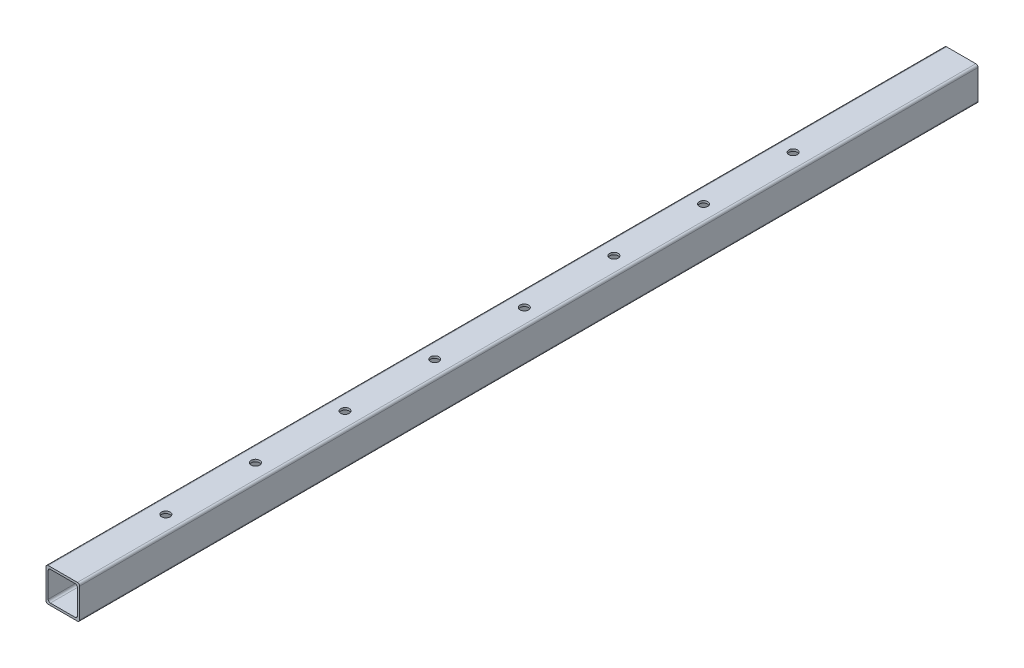
ISO-10303-21;
HEADER;
FILE_DESCRIPTION(('STEP AP214'),'2;1');
FILE_NAME('part.step','',(''),(''),'','','');
FILE_SCHEMA(('AUTOMOTIVE_DESIGN { 1 0 10303 214 1 1 1 1 }'));
ENDSEC;
DATA;
#1=APPLICATION_CONTEXT('core data for automotive mechanical design processes');
#2=APPLICATION_PROTOCOL_DEFINITION('international standard','automotive_design',2000,#1);
#3=PRODUCT_CONTEXT('',#1,'mechanical');
#4=PRODUCT('Part','Part','',(#3));
#5=PRODUCT_RELATED_PRODUCT_CATEGORY('part','',(#4));
#6=PRODUCT_DEFINITION_FORMATION('','',#4);
#7=PRODUCT_DEFINITION_CONTEXT('part definition',#1,'design');
#8=PRODUCT_DEFINITION('design','',#6,#7);
#9=PRODUCT_DEFINITION_SHAPE('','',#8);
#10=(LENGTH_UNIT() NAMED_UNIT(*) SI_UNIT(.MILLI.,.METRE.));
#11=(NAMED_UNIT(*) PLANE_ANGLE_UNIT() SI_UNIT($,.RADIAN.));
#12=(NAMED_UNIT(*) SI_UNIT($,.STERADIAN.) SOLID_ANGLE_UNIT());
#13=UNCERTAINTY_MEASURE_WITH_UNIT(LENGTH_MEASURE(1.E-05),#10,'distance_accuracy_value','');
#14=(GEOMETRIC_REPRESENTATION_CONTEXT(3) GLOBAL_UNCERTAINTY_ASSIGNED_CONTEXT((#13)) GLOBAL_UNIT_ASSIGNED_CONTEXT((#10,
#11,#12)) REPRESENTATION_CONTEXT('',''));
#15=CARTESIAN_POINT('',(0.,0.,0.));
#16=DIRECTION('',(0.,0.,1.));
#17=DIRECTION('',(1.,0.,0.));
#18=AXIS2_PLACEMENT_3D('',#15,#16,#17);
#19=CARTESIAN_POINT('',(0.,0.,254.635));
#20=DIRECTION('',(0.,0.,1.));
#21=DIRECTION('',(1.,0.,0.));
#22=AXIS2_PLACEMENT_3D('',#19,#20,#21);
#23=PLANE('',#22);
#24=DIRECTION('',(-1.,0.,0.));
#25=VECTOR('',#24,1.);
#26=CARTESIAN_POINT('',(9.525,9.525,254.635));
#27=LINE('',#26,#25);
#28=CARTESIAN_POINT('',(8.2804,9.525,254.635));
#29=VERTEX_POINT('',#28);
#30=CARTESIAN_POINT('',(-8.28039999999999,9.525,254.635));
#31=VERTEX_POINT('',#30);
#32=EDGE_CURVE('E340',#29,#31,#27,.T.);
#33=ORIENTED_EDGE('',*,*,#32,.T.);
#34=CARTESIAN_POINT('',(-8.2804,8.2804,254.635));
#35=DIRECTION('',(0.,0.,1.));
#36=DIRECTION('',(1.,0.,0.));
#37=AXIS2_PLACEMENT_3D('',#34,#35,#36);
#38=CIRCLE('',#37,1.2446);
#39=CARTESIAN_POINT('',(-9.525,8.2804,254.635));
#40=VERTEX_POINT('',#39);
#41=EDGE_CURVE('E230',#31,#40,#38,.T.);
#42=ORIENTED_EDGE('',*,*,#41,.T.);
#43=DIRECTION('',(0.,-1.,0.));
#44=VECTOR('',#43,1.);
#45=CARTESIAN_POINT('',(-9.525,9.525,254.635));
#46=LINE('',#45,#44);
#47=CARTESIAN_POINT('',(-9.525,-8.2804,254.635));
#48=VERTEX_POINT('',#47);
#49=EDGE_CURVE('E185',#40,#48,#46,.T.);
#50=ORIENTED_EDGE('',*,*,#49,.T.);
#51=CARTESIAN_POINT('',(-8.2804,-8.2804,254.635));
#52=DIRECTION('',(0.,0.,1.));
#53=DIRECTION('',(1.,0.,0.));
#54=AXIS2_PLACEMENT_3D('',#51,#52,#53);
#55=CIRCLE('',#54,1.2446);
#56=CARTESIAN_POINT('',(-8.2804,-9.525,254.635));
#57=VERTEX_POINT('',#56);
#58=EDGE_CURVE('E224',#48,#57,#55,.T.);
#59=ORIENTED_EDGE('',*,*,#58,.T.);
#60=DIRECTION('',(1.,0.,0.));
#61=VECTOR('',#60,1.);
#62=CARTESIAN_POINT('',(-9.525,-9.525,254.635));
#63=LINE('',#62,#61);
#64=CARTESIAN_POINT('',(8.28039999999999,-9.525,254.635));
#65=VERTEX_POINT('',#64);
#66=EDGE_CURVE('E208',#57,#65,#63,.T.);
#67=ORIENTED_EDGE('',*,*,#66,.T.);
#68=CARTESIAN_POINT('',(8.2804,-8.2804,254.635));
#69=DIRECTION('',(0.,0.,1.));
#70=DIRECTION('',(1.,0.,0.));
#71=AXIS2_PLACEMENT_3D('',#68,#69,#70);
#72=CIRCLE('',#71,1.2446);
#73=CARTESIAN_POINT('',(9.525,-8.2804,254.635));
#74=VERTEX_POINT('',#73);
#75=EDGE_CURVE('E227',#65,#74,#72,.T.);
#76=ORIENTED_EDGE('',*,*,#75,.T.);
#77=DIRECTION('',(0.,1.,0.));
#78=VECTOR('',#77,1.);
#79=CARTESIAN_POINT('',(9.525,-9.525,254.635));
#80=LINE('',#79,#78);
#81=CARTESIAN_POINT('',(9.525,8.2804,254.635));
#82=VERTEX_POINT('',#81);
#83=EDGE_CURVE('E201',#74,#82,#80,.T.);
#84=ORIENTED_EDGE('',*,*,#83,.T.);
#85=CARTESIAN_POINT('',(8.2804,8.2804,254.635));
#86=DIRECTION('',(0.,0.,1.));
#87=DIRECTION('',(1.,0.,0.));
#88=AXIS2_PLACEMENT_3D('',#85,#86,#87);
#89=CIRCLE('',#88,1.2446);
#90=EDGE_CURVE('E221',#82,#29,#89,.T.);
#91=ORIENTED_EDGE('',*,*,#90,.T.);
#92=EDGE_LOOP('',(#33,#42,#50,#59,#67,#76,#84,#91));
#93=FACE_BOUND('',#92,.T.);
#94=DIRECTION('',(0.,1.,0.));
#95=VECTOR('',#94,1.);
#96=CARTESIAN_POINT('',(8.2804,8.2804,254.635));
#97=LINE('',#96,#95);
#98=CARTESIAN_POINT('',(8.2804,-7.0358,254.635));
#99=VERTEX_POINT('',#98);
#100=CARTESIAN_POINT('',(8.2804,7.0358,254.635));
#101=VERTEX_POINT('',#100);
#102=EDGE_CURVE('E308',#99,#101,#97,.T.);
#103=ORIENTED_EDGE('',*,*,#102,.F.);
#104=CARTESIAN_POINT('',(7.0358,-7.0358,254.635));
#105=DIRECTION('',(0.,0.,1.));
#106=DIRECTION('',(1.,0.,0.));
#107=AXIS2_PLACEMENT_3D('',#104,#105,#106);
#108=CIRCLE('',#107,1.2446);
#109=CARTESIAN_POINT('',(7.0358,-8.2804,254.635));
#110=VERTEX_POINT('',#109);
#111=EDGE_CURVE('E277',#99,#110,#108,.F.);
#112=ORIENTED_EDGE('',*,*,#111,.T.);
#113=DIRECTION('',(1.,0.,0.));
#114=VECTOR('',#113,1.);
#115=CARTESIAN_POINT('',(8.2804,-8.2804,254.635));
#116=LINE('',#115,#114);
#117=CARTESIAN_POINT('',(-7.0358,-8.2804,254.635));
#118=VERTEX_POINT('',#117);
#119=EDGE_CURVE('E315',#118,#110,#116,.T.);
#120=ORIENTED_EDGE('',*,*,#119,.F.);
#121=CARTESIAN_POINT('',(-7.0358,-7.0358,254.635));
#122=DIRECTION('',(0.,0.,1.));
#123=DIRECTION('',(1.,0.,0.));
#124=AXIS2_PLACEMENT_3D('',#121,#122,#123);
#125=CIRCLE('',#124,1.2446);
#126=CARTESIAN_POINT('',(-8.2804,-7.0358,254.635));
#127=VERTEX_POINT('',#126);
#128=EDGE_CURVE('E283',#118,#127,#125,.F.);
#129=ORIENTED_EDGE('',*,*,#128,.T.);
#130=DIRECTION('',(0.,-1.,0.));
#131=VECTOR('',#130,1.);
#132=CARTESIAN_POINT('',(-8.2804,-8.2804,254.635));
#133=LINE('',#132,#131);
#134=CARTESIAN_POINT('',(-8.2804,7.0358,254.635));
#135=VERTEX_POINT('',#134);
#136=EDGE_CURVE('E319',#135,#127,#133,.T.);
#137=ORIENTED_EDGE('',*,*,#136,.F.);
#138=CARTESIAN_POINT('',(-7.0358,7.0358,254.635));
#139=DIRECTION('',(0.,0.,1.));
#140=DIRECTION('',(1.,0.,0.));
#141=AXIS2_PLACEMENT_3D('',#138,#139,#140);
#142=CIRCLE('',#141,1.2446);
#143=CARTESIAN_POINT('',(-7.0358,8.2804,254.635));
#144=VERTEX_POINT('',#143);
#145=EDGE_CURVE('E65',#135,#144,#142,.F.);
#146=ORIENTED_EDGE('',*,*,#145,.T.);
#147=DIRECTION('',(-1.,0.,0.));
#148=VECTOR('',#147,1.);
#149=CARTESIAN_POINT('',(-8.2804,8.2804,254.635));
#150=LINE('',#149,#148);
#151=CARTESIAN_POINT('',(7.0358,8.2804,254.635));
#152=VERTEX_POINT('',#151);
#153=EDGE_CURVE('E310',#152,#144,#150,.T.);
#154=ORIENTED_EDGE('',*,*,#153,.F.);
#155=CARTESIAN_POINT('',(7.0358,7.0358,254.635));
#156=DIRECTION('',(0.,0.,1.));
#157=DIRECTION('',(1.,0.,0.));
#158=AXIS2_PLACEMENT_3D('',#155,#156,#157);
#159=CIRCLE('',#158,1.2446);
#160=EDGE_CURVE('E11',#152,#101,#159,.F.);
#161=ORIENTED_EDGE('',*,*,#160,.T.);
#162=EDGE_LOOP('',(#103,#112,#120,#129,#137,#146,#154,#161));
#163=FACE_BOUND('',#162,.T.);
#164=ADVANCED_FACE('F49',(#93,#163),#23,.T.);
#165=CARTESIAN_POINT('',(0.,0.,-254.635));
#166=DIRECTION('',(0.,0.,1.));
#167=DIRECTION('',(1.,0.,0.));
#168=AXIS2_PLACEMENT_3D('',#165,#166,#167);
#169=PLANE('',#168);
#170=DIRECTION('',(0.,-1.,0.));
#171=VECTOR('',#170,1.);
#172=CARTESIAN_POINT('',(-9.525,9.525,-254.635));
#173=LINE('',#172,#171);
#174=CARTESIAN_POINT('',(-9.525,8.2804,-254.635));
#175=VERTEX_POINT('',#174);
#176=CARTESIAN_POINT('',(-9.525,-8.2804,-254.635));
#177=VERTEX_POINT('',#176);
#178=EDGE_CURVE('E182',#175,#177,#173,.T.);
#179=ORIENTED_EDGE('',*,*,#178,.F.);
#180=CARTESIAN_POINT('',(-8.2804,8.2804,-254.635));
#181=DIRECTION('',(0.,0.,1.));
#182=DIRECTION('',(1.,0.,0.));
#183=AXIS2_PLACEMENT_3D('',#180,#181,#182);
#184=CIRCLE('',#183,1.2446);
#185=CARTESIAN_POINT('',(-8.28039999999999,9.525,-254.635));
#186=VERTEX_POINT('',#185);
#187=EDGE_CURVE('E164',#175,#186,#184,.F.);
#188=ORIENTED_EDGE('',*,*,#187,.T.);
#189=DIRECTION('',(-1.,0.,0.));
#190=VECTOR('',#189,1.);
#191=CARTESIAN_POINT('',(9.525,9.525,-254.635));
#192=LINE('',#191,#190);
#193=CARTESIAN_POINT('',(8.2804,9.525,-254.635));
#194=VERTEX_POINT('',#193);
#195=EDGE_CURVE('E196',#194,#186,#192,.T.);
#196=ORIENTED_EDGE('',*,*,#195,.F.);
#197=CARTESIAN_POINT('',(8.2804,8.2804,-254.635));
#198=DIRECTION('',(0.,0.,1.));
#199=DIRECTION('',(1.,0.,0.));
#200=AXIS2_PLACEMENT_3D('',#197,#198,#199);
#201=CIRCLE('',#200,1.2446);
#202=CARTESIAN_POINT('',(9.525,8.2804,-254.635));
#203=VERTEX_POINT('',#202);
#204=EDGE_CURVE('E187',#194,#203,#201,.F.);
#205=ORIENTED_EDGE('',*,*,#204,.T.);
#206=DIRECTION('',(0.,1.,0.));
#207=VECTOR('',#206,1.);
#208=CARTESIAN_POINT('',(9.525,-9.525,-254.635));
#209=LINE('',#208,#207);
#210=CARTESIAN_POINT('',(9.525,-8.2804,-254.635));
#211=VERTEX_POINT('',#210);
#212=EDGE_CURVE('E203',#211,#203,#209,.T.);
#213=ORIENTED_EDGE('',*,*,#212,.F.);
#214=CARTESIAN_POINT('',(8.2804,-8.2804,-254.635));
#215=DIRECTION('',(0.,0.,1.));
#216=DIRECTION('',(1.,0.,0.));
#217=AXIS2_PLACEMENT_3D('',#214,#215,#216);
#218=CIRCLE('',#217,1.2446);
#219=CARTESIAN_POINT('',(8.28039999999999,-9.525,-254.635));
#220=VERTEX_POINT('',#219);
#221=EDGE_CURVE('E176',#211,#220,#218,.F.);
#222=ORIENTED_EDGE('',*,*,#221,.T.);
#223=DIRECTION('',(1.,0.,0.));
#224=VECTOR('',#223,1.);
#225=CARTESIAN_POINT('',(-9.525,-9.525,-254.635));
#226=LINE('',#225,#224);
#227=CARTESIAN_POINT('',(-8.2804,-9.525,-254.635));
#228=VERTEX_POINT('',#227);
#229=EDGE_CURVE('E195',#228,#220,#226,.T.);
#230=ORIENTED_EDGE('',*,*,#229,.F.);
#231=CARTESIAN_POINT('',(-8.2804,-8.2804,-254.635));
#232=DIRECTION('',(0.,0.,1.));
#233=DIRECTION('',(1.,0.,0.));
#234=AXIS2_PLACEMENT_3D('',#231,#232,#233);
#235=CIRCLE('',#234,1.2446);
#236=EDGE_CURVE('E193',#228,#177,#235,.F.);
#237=ORIENTED_EDGE('',*,*,#236,.T.);
#238=EDGE_LOOP('',(#179,#188,#196,#205,#213,#222,#230,#237));
#239=FACE_BOUND('',#238,.T.);
#240=DIRECTION('',(0.,-1.,0.));
#241=VECTOR('',#240,1.);
#242=CARTESIAN_POINT('',(-8.2804,-8.2804,-254.635));
#243=LINE('',#242,#241);
#244=CARTESIAN_POINT('',(-8.2804,7.0358,-254.635));
#245=VERTEX_POINT('',#244);
#246=CARTESIAN_POINT('',(-8.2804,-7.0358,-254.635));
#247=VERTEX_POINT('',#246);
#248=EDGE_CURVE('E302',#245,#247,#243,.T.);
#249=ORIENTED_EDGE('',*,*,#248,.T.);
#250=CARTESIAN_POINT('',(-7.0358,-7.0358,-254.635));
#251=DIRECTION('',(0.,0.,1.));
#252=DIRECTION('',(1.,0.,0.));
#253=AXIS2_PLACEMENT_3D('',#250,#251,#252);
#254=CIRCLE('',#253,1.2446);
#255=CARTESIAN_POINT('',(-7.0358,-8.2804,-254.635));
#256=VERTEX_POINT('',#255);
#257=EDGE_CURVE('E280',#247,#256,#254,.T.);
#258=ORIENTED_EDGE('',*,*,#257,.T.);
#259=DIRECTION('',(1.,0.,0.));
#260=VECTOR('',#259,1.);
#261=CARTESIAN_POINT('',(8.2804,-8.2804,-254.635));
#262=LINE('',#261,#260);
#263=CARTESIAN_POINT('',(7.0358,-8.2804,-254.635));
#264=VERTEX_POINT('',#263);
#265=EDGE_CURVE('E328',#256,#264,#262,.T.);
#266=ORIENTED_EDGE('',*,*,#265,.T.);
#267=CARTESIAN_POINT('',(7.0358,-7.0358,-254.635));
#268=DIRECTION('',(0.,0.,1.));
#269=DIRECTION('',(1.,0.,0.));
#270=AXIS2_PLACEMENT_3D('',#267,#268,#269);
#271=CIRCLE('',#270,1.2446);
#272=CARTESIAN_POINT('',(8.2804,-7.0358,-254.635));
#273=VERTEX_POINT('',#272);
#274=EDGE_CURVE('E274',#264,#273,#271,.T.);
#275=ORIENTED_EDGE('',*,*,#274,.T.);
#276=DIRECTION('',(0.,1.,0.));
#277=VECTOR('',#276,1.);
#278=CARTESIAN_POINT('',(8.2804,8.2804,-254.635));
#279=LINE('',#278,#277);
#280=CARTESIAN_POINT('',(8.2804,7.0358,-254.635));
#281=VERTEX_POINT('',#280);
#282=EDGE_CURVE('E296',#273,#281,#279,.T.);
#283=ORIENTED_EDGE('',*,*,#282,.T.);
#284=CARTESIAN_POINT('',(7.0358,7.0358,-254.635));
#285=DIRECTION('',(0.,0.,1.));
#286=DIRECTION('',(1.,0.,0.));
#287=AXIS2_PLACEMENT_3D('',#284,#285,#286);
#288=CIRCLE('',#287,1.2446);
#289=CARTESIAN_POINT('',(7.0358,8.2804,-254.635));
#290=VERTEX_POINT('',#289);
#291=EDGE_CURVE('E58',#281,#290,#288,.T.);
#292=ORIENTED_EDGE('',*,*,#291,.T.);
#293=DIRECTION('',(-1.,0.,0.));
#294=VECTOR('',#293,1.);
#295=CARTESIAN_POINT('',(-8.2804,8.2804,-254.635));
#296=LINE('',#295,#294);
#297=CARTESIAN_POINT('',(-7.0358,8.2804,-254.635));
#298=VERTEX_POINT('',#297);
#299=EDGE_CURVE('E294',#290,#298,#296,.T.);
#300=ORIENTED_EDGE('',*,*,#299,.T.);
#301=CARTESIAN_POINT('',(-7.0358,7.0358,-254.635));
#302=DIRECTION('',(0.,0.,1.));
#303=DIRECTION('',(1.,0.,0.));
#304=AXIS2_PLACEMENT_3D('',#301,#302,#303);
#305=CIRCLE('',#304,1.2446);
#306=EDGE_CURVE('E286',#298,#245,#305,.T.);
#307=ORIENTED_EDGE('',*,*,#306,.T.);
#308=EDGE_LOOP('',(#249,#258,#266,#275,#283,#292,#300,#307));
#309=FACE_BOUND('',#308,.T.);
#310=ADVANCED_FACE('F190',(#239,#309),#169,.F.);
#311=CARTESIAN_POINT('',(9.525,-9.525,254.635));
#312=DIRECTION('',(-1.,0.,0.));
#313=DIRECTION('',(0.,0.,1.));
#314=AXIS2_PLACEMENT_3D('',#311,#312,#313);
#315=PLANE('',#314);
#316=ORIENTED_EDGE('',*,*,#83,.F.);
#317=DIRECTION('',(0.,0.,-1.));
#318=VECTOR('',#317,1.);
#319=CARTESIAN_POINT('',(9.525,-8.2804,254.635));
#320=LINE('',#319,#318);
#321=EDGE_CURVE('E263',#74,#211,#320,.T.);
#322=ORIENTED_EDGE('',*,*,#321,.T.);
#323=ORIENTED_EDGE('',*,*,#212,.T.);
#324=DIRECTION('',(0.,0.,-1.));
#325=VECTOR('',#324,1.);
#326=CARTESIAN_POINT('',(9.525,8.2804,254.635));
#327=LINE('',#326,#325);
#328=EDGE_CURVE('E260',#203,#82,#327,.F.);
#329=ORIENTED_EDGE('',*,*,#328,.T.);
#330=EDGE_LOOP('',(#316,#322,#323,#329));
#331=FACE_BOUND('',#330,.T.);
#332=ADVANCED_FACE('F354',(#331),#315,.F.);
#333=CARTESIAN_POINT('',(9.525,9.525,254.635));
#334=DIRECTION('',(0.,-1.,0.));
#335=DIRECTION('',(0.,0.,-1.));
#336=AXIS2_PLACEMENT_3D('',#333,#334,#335);
#337=PLANE('',#336);
#338=CARTESIAN_POINT('',(0.,9.525,-159.385));
#339=DIRECTION('',(0.,1.,0.));
#340=DIRECTION('',(0.,0.,1.));
#341=AXIS2_PLACEMENT_3D('',#338,#339,#340);
#342=CIRCLE('',#341,2.413);
#343=CARTESIAN_POINT('',(0.,9.525,-156.972));
#344=VERTEX_POINT('',#343);
#345=EDGE_CURVE('E332',#344,#344,#342,.T.);
#346=ORIENTED_EDGE('',*,*,#345,.F.);
#347=EDGE_LOOP('',(#346));
#348=FACE_BOUND('',#347,.T.);
#349=CARTESIAN_POINT('',(0.,9.525,-108.585));
#350=DIRECTION('',(0.,1.,0.));
#351=DIRECTION('',(0.,0.,1.));
#352=AXIS2_PLACEMENT_3D('',#349,#350,#351);
#353=CIRCLE('',#352,2.413);
#354=CARTESIAN_POINT('',(0.,9.525,-106.172));
#355=VERTEX_POINT('',#354);
#356=EDGE_CURVE('E664',#355,#355,#353,.T.);
#357=ORIENTED_EDGE('',*,*,#356,.F.);
#358=EDGE_LOOP('',(#357));
#359=FACE_BOUND('',#358,.T.);
#360=CARTESIAN_POINT('',(0.,9.525,-57.785));
#361=DIRECTION('',(0.,1.,0.));
#362=DIRECTION('',(0.,0.,1.));
#363=AXIS2_PLACEMENT_3D('',#360,#361,#362);
#364=CIRCLE('',#363,2.413);
#365=CARTESIAN_POINT('',(0.,9.525,-55.372));
#366=VERTEX_POINT('',#365);
#367=EDGE_CURVE('E672',#366,#366,#364,.T.);
#368=ORIENTED_EDGE('',*,*,#367,.F.);
#369=EDGE_LOOP('',(#368));
#370=FACE_BOUND('',#369,.T.);
#371=CARTESIAN_POINT('',(0.,9.525,-6.985));
#372=DIRECTION('',(0.,1.,0.));
#373=DIRECTION('',(0.,0.,1.));
#374=AXIS2_PLACEMENT_3D('',#371,#372,#373);
#375=CIRCLE('',#374,2.413);
#376=CARTESIAN_POINT('',(0.,9.525,-4.57200000000001));
#377=VERTEX_POINT('',#376);
#378=EDGE_CURVE('E680',#377,#377,#375,.T.);
#379=ORIENTED_EDGE('',*,*,#378,.F.);
#380=EDGE_LOOP('',(#379));
#381=FACE_BOUND('',#380,.T.);
#382=CARTESIAN_POINT('',(0.,9.525,43.815));
#383=DIRECTION('',(0.,1.,0.));
#384=DIRECTION('',(0.,0.,1.));
#385=AXIS2_PLACEMENT_3D('',#382,#383,#384);
#386=CIRCLE('',#385,2.413);
#387=CARTESIAN_POINT('',(0.,9.525,46.228));
#388=VERTEX_POINT('',#387);
#389=EDGE_CURVE('E688',#388,#388,#386,.T.);
#390=ORIENTED_EDGE('',*,*,#389,.F.);
#391=EDGE_LOOP('',(#390));
#392=FACE_BOUND('',#391,.T.);
#393=CARTESIAN_POINT('',(0.,9.525,94.615));
#394=DIRECTION('',(0.,1.,0.));
#395=DIRECTION('',(0.,0.,1.));
#396=AXIS2_PLACEMENT_3D('',#393,#394,#395);
#397=CIRCLE('',#396,2.413);
#398=CARTESIAN_POINT('',(0.,9.525,97.028));
#399=VERTEX_POINT('',#398);
#400=EDGE_CURVE('E696',#399,#399,#397,.T.);
#401=ORIENTED_EDGE('',*,*,#400,.F.);
#402=EDGE_LOOP('',(#401));
#403=FACE_BOUND('',#402,.T.);
#404=CARTESIAN_POINT('',(0.,9.525,145.415));
#405=DIRECTION('',(0.,1.,0.));
#406=DIRECTION('',(0.,0.,1.));
#407=AXIS2_PLACEMENT_3D('',#404,#405,#406);
#408=CIRCLE('',#407,2.413);
#409=CARTESIAN_POINT('',(0.,9.525,147.828));
#410=VERTEX_POINT('',#409);
#411=EDGE_CURVE('E704',#410,#410,#408,.T.);
#412=ORIENTED_EDGE('',*,*,#411,.F.);
#413=EDGE_LOOP('',(#412));
#414=FACE_BOUND('',#413,.T.);
#415=CARTESIAN_POINT('',(0.,9.525,196.215));
#416=DIRECTION('',(0.,1.,0.));
#417=DIRECTION('',(0.,0.,1.));
#418=AXIS2_PLACEMENT_3D('',#415,#416,#417);
#419=CIRCLE('',#418,2.413);
#420=CARTESIAN_POINT('',(0.,9.525,198.628));
#421=VERTEX_POINT('',#420);
#422=EDGE_CURVE('E711',#421,#421,#419,.T.);
#423=ORIENTED_EDGE('',*,*,#422,.F.);
#424=EDGE_LOOP('',(#423));
#425=FACE_BOUND('',#424,.T.);
#426=ORIENTED_EDGE('',*,*,#195,.T.);
#427=DIRECTION('',(0.,0.,-1.));
#428=VECTOR('',#427,1.);
#429=CARTESIAN_POINT('',(-8.2804,9.525,254.635));
#430=LINE('',#429,#428);
#431=EDGE_CURVE('E169',#186,#31,#430,.F.);
#432=ORIENTED_EDGE('',*,*,#431,.T.);
#433=ORIENTED_EDGE('',*,*,#32,.F.);
#434=DIRECTION('',(0.,0.,-1.));
#435=VECTOR('',#434,1.);
#436=CARTESIAN_POINT('',(8.2804,9.525,254.635));
#437=LINE('',#436,#435);
#438=EDGE_CURVE('E175',#29,#194,#437,.T.);
#439=ORIENTED_EDGE('',*,*,#438,.T.);
#440=EDGE_LOOP('',(#426,#432,#433,#439));
#441=FACE_BOUND('',#440,.T.);
#442=ADVANCED_FACE('F362',(#348,#359,#370,#381,#392,#403,#414,#425,#441),#337,.F.);
#443=CARTESIAN_POINT('',(-9.525,9.525,254.635));
#444=DIRECTION('',(1.,0.,0.));
#445=DIRECTION('',(0.,0.,-1.));
#446=AXIS2_PLACEMENT_3D('',#443,#444,#445);
#447=PLANE('',#446);
#448=ORIENTED_EDGE('',*,*,#49,.F.);
#449=DIRECTION('',(0.,0.,-1.));
#450=VECTOR('',#449,1.);
#451=CARTESIAN_POINT('',(-9.525,8.2804,254.635));
#452=LINE('',#451,#450);
#453=EDGE_CURVE('E168',#40,#175,#452,.T.);
#454=ORIENTED_EDGE('',*,*,#453,.T.);
#455=ORIENTED_EDGE('',*,*,#178,.T.);
#456=DIRECTION('',(0.,0.,-1.));
#457=VECTOR('',#456,1.);
#458=CARTESIAN_POINT('',(-9.525,-8.2804,254.635));
#459=LINE('',#458,#457);
#460=EDGE_CURVE('E188',#177,#48,#459,.F.);
#461=ORIENTED_EDGE('',*,*,#460,.T.);
#462=EDGE_LOOP('',(#448,#454,#455,#461));
#463=FACE_BOUND('',#462,.T.);
#464=ADVANCED_FACE('F181',(#463),#447,.F.);
#465=CARTESIAN_POINT('',(-9.525,-9.525,254.635));
#466=DIRECTION('',(0.,1.,0.));
#467=DIRECTION('',(0.,0.,1.));
#468=AXIS2_PLACEMENT_3D('',#465,#466,#467);
#469=PLANE('',#468);
#470=ORIENTED_EDGE('',*,*,#229,.T.);
#471=DIRECTION('',(0.,0.,-1.));
#472=VECTOR('',#471,1.);
#473=CARTESIAN_POINT('',(8.2804,-9.525,254.635));
#474=LINE('',#473,#472);
#475=EDGE_CURVE('E271',#220,#65,#474,.F.);
#476=ORIENTED_EDGE('',*,*,#475,.T.);
#477=ORIENTED_EDGE('',*,*,#66,.F.);
#478=DIRECTION('',(0.,0.,-1.));
#479=VECTOR('',#478,1.);
#480=CARTESIAN_POINT('',(-8.2804,-9.525,254.635));
#481=LINE('',#480,#479);
#482=EDGE_CURVE('E267',#57,#228,#481,.T.);
#483=ORIENTED_EDGE('',*,*,#482,.T.);
#484=EDGE_LOOP('',(#470,#476,#477,#483));
#485=FACE_BOUND('',#484,.T.);
#486=ADVANCED_FACE('F371',(#485),#469,.F.);
#487=CARTESIAN_POINT('',(8.2804,-8.2804,254.635));
#488=DIRECTION('',(0.,1.,0.));
#489=DIRECTION('',(0.,0.,1.));
#490=AXIS2_PLACEMENT_3D('',#487,#488,#489);
#491=PLANE('',#490);
#492=ORIENTED_EDGE('',*,*,#119,.T.);
#493=DIRECTION('',(0.,0.,-1.));
#494=VECTOR('',#493,1.);
#495=CARTESIAN_POINT('',(7.0358,-8.2804,-254.635));
#496=LINE('',#495,#494);
#497=EDGE_CURVE('E236',#110,#264,#496,.T.);
#498=ORIENTED_EDGE('',*,*,#497,.T.);
#499=ORIENTED_EDGE('',*,*,#265,.F.);
#500=DIRECTION('',(0.,0.,-1.));
#501=VECTOR('',#500,1.);
#502=CARTESIAN_POINT('',(-7.0358,-8.2804,254.635));
#503=LINE('',#502,#501);
#504=EDGE_CURVE('E233',#256,#118,#503,.F.);
#505=ORIENTED_EDGE('',*,*,#504,.T.);
#506=EDGE_LOOP('',(#492,#498,#499,#505));
#507=FACE_BOUND('',#506,.T.);
#508=ADVANCED_FACE('F384',(#507),#491,.T.);
#509=CARTESIAN_POINT('',(8.2804,8.2804,254.635));
#510=DIRECTION('',(-1.,0.,0.));
#511=DIRECTION('',(0.,0.,1.));
#512=AXIS2_PLACEMENT_3D('',#509,#510,#511);
#513=PLANE('',#512);
#514=ORIENTED_EDGE('',*,*,#282,.F.);
#515=DIRECTION('',(0.,0.,-1.));
#516=VECTOR('',#515,1.);
#517=CARTESIAN_POINT('',(8.2804,-7.0358,254.635));
#518=LINE('',#517,#516);
#519=EDGE_CURVE('E244',#273,#99,#518,.F.);
#520=ORIENTED_EDGE('',*,*,#519,.T.);
#521=ORIENTED_EDGE('',*,*,#102,.T.);
#522=DIRECTION('',(0.,0.,-1.));
#523=VECTOR('',#522,1.);
#524=CARTESIAN_POINT('',(8.2804,7.0358,-254.635));
#525=LINE('',#524,#523);
#526=EDGE_CURVE('E240',#101,#281,#525,.T.);
#527=ORIENTED_EDGE('',*,*,#526,.T.);
#528=EDGE_LOOP('',(#514,#520,#521,#527));
#529=FACE_BOUND('',#528,.T.);
#530=ADVANCED_FACE('F312',(#529),#513,.T.);
#531=CARTESIAN_POINT('',(-8.2804,8.2804,254.635));
#532=DIRECTION('',(0.,-1.,0.));
#533=DIRECTION('',(1.,0.,0.));
#534=AXIS2_PLACEMENT_3D('',#531,#532,#533);
#535=PLANE('',#534);
#536=CARTESIAN_POINT('',(0.,8.2804,-159.385));
#537=DIRECTION('',(0.,-1.,0.));
#538=DIRECTION('',(1.,0.,0.));
#539=AXIS2_PLACEMENT_3D('',#536,#537,#538);
#540=CIRCLE('',#539,2.413);
#541=CARTESIAN_POINT('',(2.41300000000001,8.2804,-159.385));
#542=VERTEX_POINT('',#541);
#543=EDGE_CURVE('E653',#542,#542,#540,.F.);
#544=ORIENTED_EDGE('',*,*,#543,.T.);
#545=EDGE_LOOP('',(#544));
#546=FACE_BOUND('',#545,.T.);
#547=CARTESIAN_POINT('',(0.,8.2804,-108.585));
#548=DIRECTION('',(0.,-1.,0.));
#549=DIRECTION('',(1.,0.,0.));
#550=AXIS2_PLACEMENT_3D('',#547,#548,#549);
#551=CIRCLE('',#550,2.413);
#552=CARTESIAN_POINT('',(2.41300000000001,8.2804,-108.585));
#553=VERTEX_POINT('',#552);
#554=EDGE_CURVE('E658',#553,#553,#551,.F.);
#555=ORIENTED_EDGE('',*,*,#554,.T.);
#556=EDGE_LOOP('',(#555));
#557=FACE_BOUND('',#556,.T.);
#558=CARTESIAN_POINT('',(0.,8.2804,-57.785));
#559=DIRECTION('',(0.,-1.,0.));
#560=DIRECTION('',(1.,0.,0.));
#561=AXIS2_PLACEMENT_3D('',#558,#559,#560);
#562=CIRCLE('',#561,2.413);
#563=CARTESIAN_POINT('',(2.413,8.2804,-57.785));
#564=VERTEX_POINT('',#563);
#565=EDGE_CURVE('E668',#564,#564,#562,.F.);
#566=ORIENTED_EDGE('',*,*,#565,.T.);
#567=EDGE_LOOP('',(#566));
#568=FACE_BOUND('',#567,.T.);
#569=CARTESIAN_POINT('',(0.,8.2804,-6.985));
#570=DIRECTION('',(0.,-1.,0.));
#571=DIRECTION('',(1.,0.,0.));
#572=AXIS2_PLACEMENT_3D('',#569,#570,#571);
#573=CIRCLE('',#572,2.413);
#574=CARTESIAN_POINT('',(2.41299999999999,8.2804,-6.985));
#575=VERTEX_POINT('',#574);
#576=EDGE_CURVE('E676',#575,#575,#573,.F.);
#577=ORIENTED_EDGE('',*,*,#576,.T.);
#578=EDGE_LOOP('',(#577));
#579=FACE_BOUND('',#578,.T.);
#580=CARTESIAN_POINT('',(0.,8.2804,43.815));
#581=DIRECTION('',(0.,-1.,0.));
#582=DIRECTION('',(1.,0.,0.));
#583=AXIS2_PLACEMENT_3D('',#580,#581,#582);
#584=CIRCLE('',#583,2.413);
#585=CARTESIAN_POINT('',(2.41299999999999,8.2804,43.815));
#586=VERTEX_POINT('',#585);
#587=EDGE_CURVE('E684',#586,#586,#584,.F.);
#588=ORIENTED_EDGE('',*,*,#587,.T.);
#589=EDGE_LOOP('',(#588));
#590=FACE_BOUND('',#589,.T.);
#591=CARTESIAN_POINT('',(0.,8.2804,94.615));
#592=DIRECTION('',(0.,-1.,0.));
#593=DIRECTION('',(1.,0.,0.));
#594=AXIS2_PLACEMENT_3D('',#591,#592,#593);
#595=CIRCLE('',#594,2.413);
#596=CARTESIAN_POINT('',(2.41299999999998,8.2804,94.615));
#597=VERTEX_POINT('',#596);
#598=EDGE_CURVE('E692',#597,#597,#595,.F.);
#599=ORIENTED_EDGE('',*,*,#598,.T.);
#600=EDGE_LOOP('',(#599));
#601=FACE_BOUND('',#600,.T.);
#602=CARTESIAN_POINT('',(0.,8.2804,145.415));
#603=DIRECTION('',(0.,-1.,0.));
#604=DIRECTION('',(1.,0.,0.));
#605=AXIS2_PLACEMENT_3D('',#602,#603,#604);
#606=CIRCLE('',#605,2.413);
#607=CARTESIAN_POINT('',(2.41299999999998,8.2804,145.415));
#608=VERTEX_POINT('',#607);
#609=EDGE_CURVE('E700',#608,#608,#606,.F.);
#610=ORIENTED_EDGE('',*,*,#609,.T.);
#611=EDGE_LOOP('',(#610));
#612=FACE_BOUND('',#611,.T.);
#613=CARTESIAN_POINT('',(0.,8.2804,196.215));
#614=DIRECTION('',(0.,-1.,0.));
#615=DIRECTION('',(1.,0.,0.));
#616=AXIS2_PLACEMENT_3D('',#613,#614,#615);
#617=CIRCLE('',#616,2.413);
#618=CARTESIAN_POINT('',(2.41299999999998,8.2804,196.215));
#619=VERTEX_POINT('',#618);
#620=EDGE_CURVE('E708',#619,#619,#617,.F.);
#621=ORIENTED_EDGE('',*,*,#620,.T.);
#622=EDGE_LOOP('',(#621));
#623=FACE_BOUND('',#622,.T.);
#624=ORIENTED_EDGE('',*,*,#153,.T.);
#625=DIRECTION('',(0.,0.,-1.));
#626=VECTOR('',#625,1.);
#627=CARTESIAN_POINT('',(-7.0358,8.2804,-254.635));
#628=LINE('',#627,#626);
#629=EDGE_CURVE('E256',#144,#298,#628,.T.);
#630=ORIENTED_EDGE('',*,*,#629,.T.);
#631=ORIENTED_EDGE('',*,*,#299,.F.);
#632=DIRECTION('',(0.,0.,-1.));
#633=VECTOR('',#632,1.);
#634=CARTESIAN_POINT('',(7.0358,8.2804,254.635));
#635=LINE('',#634,#633);
#636=EDGE_CURVE('E72',#290,#152,#635,.F.);
#637=ORIENTED_EDGE('',*,*,#636,.T.);
#638=EDGE_LOOP('',(#624,#630,#631,#637));
#639=FACE_BOUND('',#638,.T.);
#640=ADVANCED_FACE('F299',(#546,#557,#568,#579,#590,#601,#612,#623,#639),#535,.T.);
#641=CARTESIAN_POINT('',(-8.2804,-8.2804,254.635));
#642=DIRECTION('',(1.,0.,0.));
#643=DIRECTION('',(0.,1.,0.));
#644=AXIS2_PLACEMENT_3D('',#641,#642,#643);
#645=PLANE('',#644);
#646=ORIENTED_EDGE('',*,*,#136,.T.);
#647=DIRECTION('',(0.,0.,-1.));
#648=VECTOR('',#647,1.);
#649=CARTESIAN_POINT('',(-8.2804,-7.0358,-254.635));
#650=LINE('',#649,#648);
#651=EDGE_CURVE('E250',#127,#247,#650,.T.);
#652=ORIENTED_EDGE('',*,*,#651,.T.);
#653=ORIENTED_EDGE('',*,*,#248,.F.);
#654=DIRECTION('',(0.,0.,-1.));
#655=VECTOR('',#654,1.);
#656=CARTESIAN_POINT('',(-8.2804,7.0358,254.635));
#657=LINE('',#656,#655);
#658=EDGE_CURVE('E247',#245,#135,#657,.F.);
#659=ORIENTED_EDGE('',*,*,#658,.T.);
#660=EDGE_LOOP('',(#646,#652,#653,#659));
#661=FACE_BOUND('',#660,.T.);
#662=ADVANCED_FACE('F425',(#661),#645,.T.);
#663=CARTESIAN_POINT('',(-8.2804,8.2804,254.635));
#664=DIRECTION('',(0.,0.,-1.));
#665=DIRECTION('',(-1.,0.,0.));
#666=AXIS2_PLACEMENT_3D('',#663,#664,#665);
#667=CYLINDRICAL_SURFACE('',#666,1.2446);
#668=ORIENTED_EDGE('',*,*,#41,.F.);
#669=ORIENTED_EDGE('',*,*,#431,.F.);
#670=ORIENTED_EDGE('',*,*,#187,.F.);
#671=ORIENTED_EDGE('',*,*,#453,.F.);
#672=EDGE_LOOP('',(#668,#669,#670,#671));
#673=FACE_BOUND('',#672,.T.);
#674=ADVANCED_FACE('F167',(#673),#667,.T.);
#675=CARTESIAN_POINT('',(7.0358,-7.0358,254.635));
#676=DIRECTION('',(0.,0.,1.));
#677=DIRECTION('',(1.,0.,0.));
#678=AXIS2_PLACEMENT_3D('',#675,#676,#677);
#679=CYLINDRICAL_SURFACE('',#678,1.2446);
#680=ORIENTED_EDGE('',*,*,#111,.F.);
#681=ORIENTED_EDGE('',*,*,#519,.F.);
#682=ORIENTED_EDGE('',*,*,#274,.F.);
#683=ORIENTED_EDGE('',*,*,#497,.F.);
#684=EDGE_LOOP('',(#680,#681,#682,#683));
#685=FACE_BOUND('',#684,.T.);
#686=ADVANCED_FACE('F419',(#685),#679,.F.);
#687=CARTESIAN_POINT('',(-7.0358,-7.0358,254.635));
#688=DIRECTION('',(0.,0.,1.));
#689=DIRECTION('',(1.,0.,0.));
#690=AXIS2_PLACEMENT_3D('',#687,#688,#689);
#691=CYLINDRICAL_SURFACE('',#690,1.2446);
#692=ORIENTED_EDGE('',*,*,#128,.F.);
#693=ORIENTED_EDGE('',*,*,#504,.F.);
#694=ORIENTED_EDGE('',*,*,#257,.F.);
#695=ORIENTED_EDGE('',*,*,#651,.F.);
#696=EDGE_LOOP('',(#692,#693,#694,#695));
#697=FACE_BOUND('',#696,.T.);
#698=ADVANCED_FACE('F415',(#697),#691,.F.);
#699=CARTESIAN_POINT('',(-7.0358,7.0358,254.635));
#700=DIRECTION('',(0.,0.,1.));
#701=DIRECTION('',(1.,0.,0.));
#702=AXIS2_PLACEMENT_3D('',#699,#700,#701);
#703=CYLINDRICAL_SURFACE('',#702,1.2446);
#704=ORIENTED_EDGE('',*,*,#145,.F.);
#705=ORIENTED_EDGE('',*,*,#658,.F.);
#706=ORIENTED_EDGE('',*,*,#306,.F.);
#707=ORIENTED_EDGE('',*,*,#629,.F.);
#708=EDGE_LOOP('',(#704,#705,#706,#707));
#709=FACE_BOUND('',#708,.T.);
#710=ADVANCED_FACE('F412',(#709),#703,.F.);
#711=CARTESIAN_POINT('',(7.0358,7.0358,254.635));
#712=DIRECTION('',(0.,0.,1.));
#713=DIRECTION('',(1.,0.,0.));
#714=AXIS2_PLACEMENT_3D('',#711,#712,#713);
#715=CYLINDRICAL_SURFACE('',#714,1.2446);
#716=ORIENTED_EDGE('',*,*,#160,.F.);
#717=ORIENTED_EDGE('',*,*,#636,.F.);
#718=ORIENTED_EDGE('',*,*,#291,.F.);
#719=ORIENTED_EDGE('',*,*,#526,.F.);
#720=EDGE_LOOP('',(#716,#717,#718,#719));
#721=FACE_BOUND('',#720,.T.);
#722=ADVANCED_FACE('F305',(#721),#715,.F.);
#723=CARTESIAN_POINT('',(8.2804,-8.2804,254.635));
#724=DIRECTION('',(0.,0.,-1.));
#725=DIRECTION('',(-1.,0.,0.));
#726=AXIS2_PLACEMENT_3D('',#723,#724,#725);
#727=CYLINDRICAL_SURFACE('',#726,1.2446);
#728=ORIENTED_EDGE('',*,*,#75,.F.);
#729=ORIENTED_EDGE('',*,*,#475,.F.);
#730=ORIENTED_EDGE('',*,*,#221,.F.);
#731=ORIENTED_EDGE('',*,*,#321,.F.);
#732=EDGE_LOOP('',(#728,#729,#730,#731));
#733=FACE_BOUND('',#732,.T.);
#734=ADVANCED_FACE('F398',(#733),#727,.T.);
#735=CARTESIAN_POINT('',(-8.2804,-8.2804,254.635));
#736=DIRECTION('',(0.,0.,-1.));
#737=DIRECTION('',(-1.,0.,0.));
#738=AXIS2_PLACEMENT_3D('',#735,#736,#737);
#739=CYLINDRICAL_SURFACE('',#738,1.2446);
#740=ORIENTED_EDGE('',*,*,#58,.F.);
#741=ORIENTED_EDGE('',*,*,#460,.F.);
#742=ORIENTED_EDGE('',*,*,#236,.F.);
#743=ORIENTED_EDGE('',*,*,#482,.F.);
#744=EDGE_LOOP('',(#740,#741,#742,#743));
#745=FACE_BOUND('',#744,.T.);
#746=ADVANCED_FACE('F401',(#745),#739,.T.);
#747=CARTESIAN_POINT('',(8.2804,8.2804,254.635));
#748=DIRECTION('',(0.,0.,-1.));
#749=DIRECTION('',(-1.,0.,0.));
#750=AXIS2_PLACEMENT_3D('',#747,#748,#749);
#751=CYLINDRICAL_SURFACE('',#750,1.2446);
#752=ORIENTED_EDGE('',*,*,#90,.F.);
#753=ORIENTED_EDGE('',*,*,#328,.F.);
#754=ORIENTED_EDGE('',*,*,#204,.F.);
#755=ORIENTED_EDGE('',*,*,#438,.F.);
#756=EDGE_LOOP('',(#752,#753,#754,#755));
#757=FACE_BOUND('',#756,.T.);
#758=ADVANCED_FACE('F51',(#757),#751,.T.);
#759=CARTESIAN_POINT('',(0.,-9.526,196.215));
#760=DIRECTION('',(0.,1.,0.));
#761=DIRECTION('',(0.,0.,1.));
#762=AXIS2_PLACEMENT_3D('',#759,#760,#761);
#763=CYLINDRICAL_SURFACE('',#762,2.413);
#764=ORIENTED_EDGE('',*,*,#620,.F.);
#765=EDGE_LOOP('',(#764));
#766=FACE_BOUND('',#765,.T.);
#767=ORIENTED_EDGE('',*,*,#422,.T.);
#768=EDGE_LOOP('',(#767));
#769=FACE_BOUND('',#768,.T.);
#770=ADVANCED_FACE('F407',(#766,#769),#763,.F.);
#771=CARTESIAN_POINT('',(0.,-9.526,145.415));
#772=DIRECTION('',(0.,1.,0.));
#773=DIRECTION('',(0.,0.,1.));
#774=AXIS2_PLACEMENT_3D('',#771,#772,#773);
#775=CYLINDRICAL_SURFACE('',#774,2.413);
#776=ORIENTED_EDGE('',*,*,#609,.F.);
#777=EDGE_LOOP('',(#776));
#778=FACE_BOUND('',#777,.T.);
#779=ORIENTED_EDGE('',*,*,#411,.T.);
#780=EDGE_LOOP('',(#779));
#781=FACE_BOUND('',#780,.T.);
#782=ADVANCED_FACE('F456',(#778,#781),#775,.F.);
#783=CARTESIAN_POINT('',(0.,-9.526,94.615));
#784=DIRECTION('',(0.,1.,0.));
#785=DIRECTION('',(0.,0.,1.));
#786=AXIS2_PLACEMENT_3D('',#783,#784,#785);
#787=CYLINDRICAL_SURFACE('',#786,2.413);
#788=ORIENTED_EDGE('',*,*,#598,.F.);
#789=EDGE_LOOP('',(#788));
#790=FACE_BOUND('',#789,.T.);
#791=ORIENTED_EDGE('',*,*,#400,.T.);
#792=EDGE_LOOP('',(#791));
#793=FACE_BOUND('',#792,.T.);
#794=ADVANCED_FACE('F465',(#790,#793),#787,.F.);
#795=CARTESIAN_POINT('',(0.,-9.526,43.815));
#796=DIRECTION('',(0.,1.,0.));
#797=DIRECTION('',(0.,0.,1.));
#798=AXIS2_PLACEMENT_3D('',#795,#796,#797);
#799=CYLINDRICAL_SURFACE('',#798,2.413);
#800=ORIENTED_EDGE('',*,*,#587,.F.);
#801=EDGE_LOOP('',(#800));
#802=FACE_BOUND('',#801,.T.);
#803=ORIENTED_EDGE('',*,*,#389,.T.);
#804=EDGE_LOOP('',(#803));
#805=FACE_BOUND('',#804,.T.);
#806=ADVANCED_FACE('F473',(#802,#805),#799,.F.);
#807=CARTESIAN_POINT('',(0.,-9.526,-6.985));
#808=DIRECTION('',(0.,1.,0.));
#809=DIRECTION('',(0.,0.,1.));
#810=AXIS2_PLACEMENT_3D('',#807,#808,#809);
#811=CYLINDRICAL_SURFACE('',#810,2.413);
#812=ORIENTED_EDGE('',*,*,#576,.F.);
#813=EDGE_LOOP('',(#812));
#814=FACE_BOUND('',#813,.T.);
#815=ORIENTED_EDGE('',*,*,#378,.T.);
#816=EDGE_LOOP('',(#815));
#817=FACE_BOUND('',#816,.T.);
#818=ADVANCED_FACE('F482',(#814,#817),#811,.F.);
#819=CARTESIAN_POINT('',(0.,-9.526,-57.785));
#820=DIRECTION('',(0.,1.,0.));
#821=DIRECTION('',(0.,0.,1.));
#822=AXIS2_PLACEMENT_3D('',#819,#820,#821);
#823=CYLINDRICAL_SURFACE('',#822,2.413);
#824=ORIENTED_EDGE('',*,*,#565,.F.);
#825=EDGE_LOOP('',(#824));
#826=FACE_BOUND('',#825,.T.);
#827=ORIENTED_EDGE('',*,*,#367,.T.);
#828=EDGE_LOOP('',(#827));
#829=FACE_BOUND('',#828,.T.);
#830=ADVANCED_FACE('F491',(#826,#829),#823,.F.);
#831=CARTESIAN_POINT('',(0.,-9.526,-108.585));
#832=DIRECTION('',(0.,1.,0.));
#833=DIRECTION('',(0.,0.,1.));
#834=AXIS2_PLACEMENT_3D('',#831,#832,#833);
#835=CYLINDRICAL_SURFACE('',#834,2.413);
#836=ORIENTED_EDGE('',*,*,#554,.F.);
#837=EDGE_LOOP('',(#836));
#838=FACE_BOUND('',#837,.T.);
#839=ORIENTED_EDGE('',*,*,#356,.T.);
#840=EDGE_LOOP('',(#839));
#841=FACE_BOUND('',#840,.T.);
#842=ADVANCED_FACE('F500',(#838,#841),#835,.F.);
#843=CARTESIAN_POINT('',(0.,-9.526,-159.385));
#844=DIRECTION('',(0.,1.,0.));
#845=DIRECTION('',(0.,0.,1.));
#846=AXIS2_PLACEMENT_3D('',#843,#844,#845);
#847=CYLINDRICAL_SURFACE('',#846,2.413);
#848=ORIENTED_EDGE('',*,*,#543,.F.);
#849=EDGE_LOOP('',(#848));
#850=FACE_BOUND('',#849,.T.);
#851=ORIENTED_EDGE('',*,*,#345,.T.);
#852=EDGE_LOOP('',(#851));
#853=FACE_BOUND('',#852,.T.);
#854=ADVANCED_FACE('F509',(#850,#853),#847,.F.);
#855=CLOSED_SHELL('',(#164,#310,#332,#442,#464,#486,#508,#530,#640,#662,#674,#686,#698,#710,
#722,#734,#746,#758,#770,#782,#794,#806,#818,#830,#842,#854));
#856=MANIFOLD_SOLID_BREP('B2',#855);
#857=ADVANCED_BREP_SHAPE_REPRESENTATION('',(#18,#856),#14);
#858=SHAPE_DEFINITION_REPRESENTATION(#9,#857);
ENDSEC;
END-ISO-10303-21;
